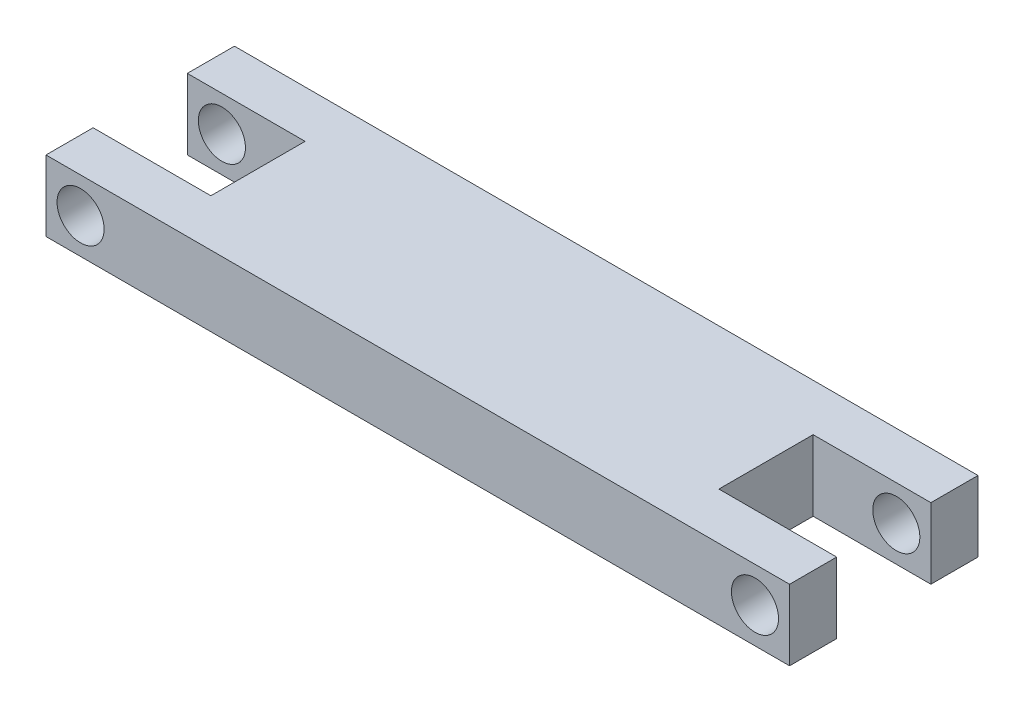
ISO-10303-21;
HEADER;
FILE_DESCRIPTION(('STEP AP214'),'2;1');
FILE_NAME('part.step','',(''),(''),'','','');
FILE_SCHEMA(('AUTOMOTIVE_DESIGN { 1 0 10303 214 1 1 1 1 }'));
ENDSEC;
DATA;
#1=APPLICATION_CONTEXT('core data for automotive mechanical design processes');
#2=APPLICATION_PROTOCOL_DEFINITION('international standard','automotive_design',2000,#1);
#3=PRODUCT_CONTEXT('',#1,'mechanical');
#4=PRODUCT('Part','Part','',(#3));
#5=PRODUCT_RELATED_PRODUCT_CATEGORY('part','',(#4));
#6=PRODUCT_DEFINITION_FORMATION('','',#4);
#7=PRODUCT_DEFINITION_CONTEXT('part definition',#1,'design');
#8=PRODUCT_DEFINITION('design','',#6,#7);
#9=PRODUCT_DEFINITION_SHAPE('','',#8);
#10=(LENGTH_UNIT() NAMED_UNIT(*) SI_UNIT(.MILLI.,.METRE.));
#11=(NAMED_UNIT(*) PLANE_ANGLE_UNIT() SI_UNIT($,.RADIAN.));
#12=(NAMED_UNIT(*) SI_UNIT($,.STERADIAN.) SOLID_ANGLE_UNIT());
#13=UNCERTAINTY_MEASURE_WITH_UNIT(LENGTH_MEASURE(1.E-05),#10,'distance_accuracy_value','');
#14=(GEOMETRIC_REPRESENTATION_CONTEXT(3) GLOBAL_UNCERTAINTY_ASSIGNED_CONTEXT((#13)) GLOBAL_UNIT_ASSIGNED_CONTEXT((#10,
#11,#12)) REPRESENTATION_CONTEXT('',''));
#15=CARTESIAN_POINT('',(0.,0.,0.));
#16=DIRECTION('',(0.,0.,1.));
#17=DIRECTION('',(1.,0.,0.));
#18=AXIS2_PLACEMENT_3D('',#15,#16,#17);
#19=CARTESIAN_POINT('',(-73.640350877193,15.5701754385965,40.));
#20=DIRECTION('',(1.,0.,0.));
#21=DIRECTION('',(0.,0.,-1.));
#22=AXIS2_PLACEMENT_3D('',#19,#20,#21);
#23=PLANE('',#22);
#24=DIRECTION('',(0.,0.,-1.));
#25=VECTOR('',#24,1.);
#26=CARTESIAN_POINT('',(-73.640350877193,15.5701754385965,40.));
#27=LINE('',#26,#25);
#28=CARTESIAN_POINT('',(-73.640350877193,15.5701754385965,40.));
#29=VERTEX_POINT('',#28);
#30=CARTESIAN_POINT('',(-73.640350877193,15.5701754385965,30.));
#31=VERTEX_POINT('',#30);
#32=EDGE_CURVE('E44',#29,#31,#27,.T.);
#33=ORIENTED_EDGE('',*,*,#32,.T.);
#34=DIRECTION('',(0.,-1.,0.));
#35=VECTOR('',#34,1.);
#36=CARTESIAN_POINT('',(-73.640350877193,15.5701754385965,30.));
#37=LINE('',#36,#35);
#38=CARTESIAN_POINT('',(-73.640350877193,0.570175438596493,30.));
#39=VERTEX_POINT('',#38);
#40=EDGE_CURVE('E118',#31,#39,#37,.T.);
#41=ORIENTED_EDGE('',*,*,#40,.T.);
#42=DIRECTION('',(0.,0.,-1.));
#43=VECTOR('',#42,1.);
#44=CARTESIAN_POINT('',(-73.640350877193,0.570175438596493,40.));
#45=LINE('',#44,#43);
#46=CARTESIAN_POINT('',(-73.640350877193,0.570175438596493,40.));
#47=VERTEX_POINT('',#46);
#48=EDGE_CURVE('E83',#47,#39,#45,.T.);
#49=ORIENTED_EDGE('',*,*,#48,.F.);
#50=DIRECTION('',(0.,-1.,0.));
#51=VECTOR('',#50,1.);
#52=CARTESIAN_POINT('',(-73.640350877193,15.5701754385965,40.));
#53=LINE('',#52,#51);
#54=EDGE_CURVE('E60',#29,#47,#53,.T.);
#55=ORIENTED_EDGE('',*,*,#54,.F.);
#56=EDGE_LOOP('',(#33,#41,#49,#55));
#57=FACE_BOUND('',#56,.T.);
#58=ADVANCED_FACE('F36',(#57),#23,.F.);
#59=CARTESIAN_POINT('',(-66.3006315789474,8.07017543859649,40.));
#60=DIRECTION('',(0.,0.,-1.));
#61=DIRECTION('',(-1.,0.,0.));
#62=AXIS2_PLACEMENT_3D('',#59,#60,#61);
#63=CYLINDRICAL_SURFACE('',#62,5.);
#64=CARTESIAN_POINT('',(-66.3006315789474,8.07017543859649,30.));
#65=DIRECTION('',(0.,0.,1.));
#66=DIRECTION('',(1.,0.,0.));
#67=AXIS2_PLACEMENT_3D('',#64,#65,#66);
#68=CIRCLE('',#67,5.);
#69=CARTESIAN_POINT('',(-61.3006315789474,8.07017543859649,30.));
#70=VERTEX_POINT('',#69);
#71=EDGE_CURVE('E112',#70,#70,#68,.T.);
#72=ORIENTED_EDGE('',*,*,#71,.F.);
#73=EDGE_LOOP('',(#72));
#74=FACE_BOUND('',#73,.T.);
#75=CARTESIAN_POINT('',(-66.3006315789474,8.07017543859649,40.));
#76=DIRECTION('',(0.,0.,1.));
#77=DIRECTION('',(1.,0.,0.));
#78=AXIS2_PLACEMENT_3D('',#75,#76,#77);
#79=CIRCLE('',#78,5.);
#80=CARTESIAN_POINT('',(-61.3006315789474,8.07017543859649,40.));
#81=VERTEX_POINT('',#80);
#82=EDGE_CURVE('E128',#81,#81,#79,.T.);
#83=ORIENTED_EDGE('',*,*,#82,.T.);
#84=EDGE_LOOP('',(#83));
#85=FACE_BOUND('',#84,.T.);
#86=ADVANCED_FACE('F282',(#74,#85),#63,.F.);
#87=CARTESIAN_POINT('',(0.,0.,40.));
#88=DIRECTION('',(0.,0.,1.));
#89=DIRECTION('',(1.,0.,0.));
#90=AXIS2_PLACEMENT_3D('',#87,#88,#89);
#91=PLANE('',#90);
#92=DIRECTION('',(1.,0.,0.));
#93=VECTOR('',#92,1.);
#94=CARTESIAN_POINT('',(-73.640350877193,0.570175438596493,40.));
#95=LINE('',#94,#93);
#96=CARTESIAN_POINT('',(84.1959975439387,0.570175438596493,40.));
#97=VERTEX_POINT('',#96);
#98=EDGE_CURVE('E84',#47,#97,#95,.T.);
#99=ORIENTED_EDGE('',*,*,#98,.T.);
#100=DIRECTION('',(0.,-1.,0.));
#101=VECTOR('',#100,1.);
#102=CARTESIAN_POINT('',(84.1959975439387,15.5701754385965,40.));
#103=LINE('',#102,#101);
#104=CARTESIAN_POINT('',(84.1959975439387,15.5701754385965,40.));
#105=VERTEX_POINT('',#104);
#106=EDGE_CURVE('E186',#105,#97,#103,.T.);
#107=ORIENTED_EDGE('',*,*,#106,.F.);
#108=DIRECTION('',(-1.,0.,0.));
#109=VECTOR('',#108,1.);
#110=CARTESIAN_POINT('',(-73.640350877193,15.5701754385965,40.));
#111=LINE('',#110,#109);
#112=EDGE_CURVE('E101',#105,#29,#111,.T.);
#113=ORIENTED_EDGE('',*,*,#112,.T.);
#114=ORIENTED_EDGE('',*,*,#54,.T.);
#115=EDGE_LOOP('',(#99,#107,#113,#114));
#116=FACE_BOUND('',#115,.T.);
#117=ORIENTED_EDGE('',*,*,#82,.F.);
#118=EDGE_LOOP('',(#117));
#119=FACE_BOUND('',#118,.T.);
#120=CARTESIAN_POINT('',(76.856278245693,8.07017543859649,40.));
#121=DIRECTION('',(0.,0.,-1.));
#122=DIRECTION('',(-1.,0.,0.));
#123=AXIS2_PLACEMENT_3D('',#120,#121,#122);
#124=CIRCLE('',#123,5.);
#125=CARTESIAN_POINT('',(71.8562782456931,8.07017543859649,40.));
#126=VERTEX_POINT('',#125);
#127=EDGE_CURVE('E243',#126,#126,#124,.T.);
#128=ORIENTED_EDGE('',*,*,#127,.T.);
#129=EDGE_LOOP('',(#128));
#130=FACE_BOUND('',#129,.T.);
#131=ADVANCED_FACE('F184',(#116,#119,#130),#91,.T.);
#132=CARTESIAN_POINT('',(0.,0.,0.));
#133=DIRECTION('',(0.,0.,1.));
#134=DIRECTION('',(1.,0.,0.));
#135=AXIS2_PLACEMENT_3D('',#132,#133,#134);
#136=PLANE('',#135);
#137=DIRECTION('',(-1.,0.,0.));
#138=VECTOR('',#137,1.);
#139=CARTESIAN_POINT('',(-73.640350877193,15.5701754385965,0.));
#140=LINE('',#139,#138);
#141=CARTESIAN_POINT('',(84.1959975439387,15.5701754385965,0.));
#142=VERTEX_POINT('',#141);
#143=CARTESIAN_POINT('',(-73.640350877193,15.5701754385965,0.));
#144=VERTEX_POINT('',#143);
#145=EDGE_CURVE('E94',#142,#144,#140,.T.);
#146=ORIENTED_EDGE('',*,*,#145,.F.);
#147=DIRECTION('',(0.,-1.,0.));
#148=VECTOR('',#147,1.);
#149=CARTESIAN_POINT('',(84.1959975439387,15.5701754385965,0.));
#150=LINE('',#149,#148);
#151=CARTESIAN_POINT('',(84.1959975439387,0.570175438596493,0.));
#152=VERTEX_POINT('',#151);
#153=EDGE_CURVE('E100',#142,#152,#150,.T.);
#154=ORIENTED_EDGE('',*,*,#153,.T.);
#155=DIRECTION('',(1.,0.,0.));
#156=VECTOR('',#155,1.);
#157=CARTESIAN_POINT('',(-73.640350877193,0.570175438596493,0.));
#158=LINE('',#157,#156);
#159=CARTESIAN_POINT('',(-73.640350877193,0.570175438596493,0.));
#160=VERTEX_POINT('',#159);
#161=EDGE_CURVE('E79',#160,#152,#158,.T.);
#162=ORIENTED_EDGE('',*,*,#161,.F.);
#163=DIRECTION('',(0.,-1.,0.));
#164=VECTOR('',#163,1.);
#165=CARTESIAN_POINT('',(-73.640350877193,15.5701754385965,0.));
#166=LINE('',#165,#164);
#167=EDGE_CURVE('E88',#144,#160,#166,.T.);
#168=ORIENTED_EDGE('',*,*,#167,.F.);
#169=EDGE_LOOP('',(#146,#154,#162,#168));
#170=FACE_BOUND('',#169,.T.);
#171=CARTESIAN_POINT('',(-66.3006315789474,8.07017543859649,0.));
#172=DIRECTION('',(0.,0.,1.));
#173=DIRECTION('',(1.,0.,0.));
#174=AXIS2_PLACEMENT_3D('',#171,#172,#173);
#175=CIRCLE('',#174,5.);
#176=CARTESIAN_POINT('',(-61.3006315789474,8.07017543859649,0.));
#177=VERTEX_POINT('',#176);
#178=EDGE_CURVE('E127',#177,#177,#175,.T.);
#179=ORIENTED_EDGE('',*,*,#178,.T.);
#180=EDGE_LOOP('',(#179));
#181=FACE_BOUND('',#180,.T.);
#182=CARTESIAN_POINT('',(76.856278245693,8.07017543859649,0.));
#183=DIRECTION('',(0.,0.,-1.));
#184=DIRECTION('',(-1.,0.,0.));
#185=AXIS2_PLACEMENT_3D('',#182,#183,#184);
#186=CIRCLE('',#185,5.);
#187=CARTESIAN_POINT('',(71.8562782456931,8.07017543859649,0.));
#188=VERTEX_POINT('',#187);
#189=EDGE_CURVE('E242',#188,#188,#186,.T.);
#190=ORIENTED_EDGE('',*,*,#189,.F.);
#191=EDGE_LOOP('',(#190));
#192=FACE_BOUND('',#191,.T.);
#193=ADVANCED_FACE('F97',(#170,#181,#192),#136,.F.);
#194=CARTESIAN_POINT('',(-73.640350877193,15.5701754385965,40.));
#195=DIRECTION('',(0.,-1.,0.));
#196=DIRECTION('',(0.,0.,-1.));
#197=AXIS2_PLACEMENT_3D('',#194,#195,#196);
#198=PLANE('',#197);
#199=ORIENTED_EDGE('',*,*,#112,.F.);
#200=DIRECTION('',(0.,0.,-1.));
#201=VECTOR('',#200,1.);
#202=CARTESIAN_POINT('',(84.1959975439387,15.5701754385965,40.));
#203=LINE('',#202,#201);
#204=CARTESIAN_POINT('',(84.1959975439387,15.5701754385965,30.));
#205=VERTEX_POINT('',#204);
#206=EDGE_CURVE('E252',#105,#205,#203,.T.);
#207=ORIENTED_EDGE('',*,*,#206,.T.);
#208=DIRECTION('',(-1.,0.,0.));
#209=VECTOR('',#208,1.);
#210=CARTESIAN_POINT('',(109.195997543939,15.5701754385965,30.));
#211=LINE('',#210,#209);
#212=CARTESIAN_POINT('',(59.1959975439387,15.5701754385965,30.));
#213=VERTEX_POINT('',#212);
#214=EDGE_CURVE('E220',#205,#213,#211,.T.);
#215=ORIENTED_EDGE('',*,*,#214,.T.);
#216=DIRECTION('',(0.,0.,-1.));
#217=VECTOR('',#216,1.);
#218=CARTESIAN_POINT('',(59.1959975439387,15.5701754385965,10.));
#219=LINE('',#218,#217);
#220=CARTESIAN_POINT('',(59.1959975439387,15.5701754385965,10.));
#221=VERTEX_POINT('',#220);
#222=EDGE_CURVE('E213',#213,#221,#219,.T.);
#223=ORIENTED_EDGE('',*,*,#222,.T.);
#224=DIRECTION('',(1.,0.,0.));
#225=VECTOR('',#224,1.);
#226=CARTESIAN_POINT('',(109.195997543939,15.5701754385965,10.));
#227=LINE('',#226,#225);
#228=CARTESIAN_POINT('',(84.1959975439387,15.5701754385965,10.));
#229=VERTEX_POINT('',#228);
#230=EDGE_CURVE('E222',#221,#229,#227,.T.);
#231=ORIENTED_EDGE('',*,*,#230,.T.);
#232=EDGE_CURVE('E141',#229,#142,#203,.T.);
#233=ORIENTED_EDGE('',*,*,#232,.T.);
#234=ORIENTED_EDGE('',*,*,#145,.T.);
#235=CARTESIAN_POINT('',(-73.640350877193,15.5701754385965,10.));
#236=VERTEX_POINT('',#235);
#237=EDGE_CURVE('E91',#236,#144,#27,.T.);
#238=ORIENTED_EDGE('',*,*,#237,.F.);
#239=DIRECTION('',(-1.,0.,0.));
#240=VECTOR('',#239,1.);
#241=CARTESIAN_POINT('',(-98.640350877193,15.5701754385965,10.));
#242=LINE('',#241,#240);
#243=CARTESIAN_POINT('',(-48.640350877193,15.5701754385965,10.));
#244=VERTEX_POINT('',#243);
#245=EDGE_CURVE('E262',#244,#236,#242,.T.);
#246=ORIENTED_EDGE('',*,*,#245,.F.);
#247=DIRECTION('',(0.,0.,-1.));
#248=VECTOR('',#247,1.);
#249=CARTESIAN_POINT('',(-48.640350877193,15.5701754385965,10.));
#250=LINE('',#249,#248);
#251=CARTESIAN_POINT('',(-48.640350877193,15.5701754385965,30.));
#252=VERTEX_POINT('',#251);
#253=EDGE_CURVE('E259',#252,#244,#250,.T.);
#254=ORIENTED_EDGE('',*,*,#253,.F.);
#255=DIRECTION('',(1.,0.,0.));
#256=VECTOR('',#255,1.);
#257=CARTESIAN_POINT('',(-98.640350877193,15.5701754385965,30.));
#258=LINE('',#257,#256);
#259=EDGE_CURVE('E264',#31,#252,#258,.T.);
#260=ORIENTED_EDGE('',*,*,#259,.F.);
#261=ORIENTED_EDGE('',*,*,#32,.F.);
#262=EDGE_LOOP('',(#199,#207,#215,#223,#231,#233,#234,#238,#246,#254,#260,#261));
#263=FACE_BOUND('',#262,.T.);
#264=ADVANCED_FACE('F38',(#263),#198,.F.);
#265=CARTESIAN_POINT('',(-73.640350877193,0.570175438596493,10.));
#266=VERTEX_POINT('',#265);
#267=EDGE_CURVE('E73',#266,#160,#45,.T.);
#268=ORIENTED_EDGE('',*,*,#267,.F.);
#269=DIRECTION('',(0.,1.,0.));
#270=VECTOR('',#269,1.);
#271=CARTESIAN_POINT('',(-73.640350877193,15.5701754385965,10.));
#272=LINE('',#271,#270);
#273=EDGE_CURVE('E51',#266,#236,#272,.T.);
#274=ORIENTED_EDGE('',*,*,#273,.T.);
#275=ORIENTED_EDGE('',*,*,#237,.T.);
#276=ORIENTED_EDGE('',*,*,#167,.T.);
#277=EDGE_LOOP('',(#268,#274,#275,#276));
#278=FACE_BOUND('',#277,.T.);
#279=ADVANCED_FACE('F89',(#278),#23,.F.);
#280=CARTESIAN_POINT('',(-73.640350877193,0.570175438596493,40.));
#281=DIRECTION('',(0.,1.,0.));
#282=DIRECTION('',(0.,0.,1.));
#283=AXIS2_PLACEMENT_3D('',#280,#281,#282);
#284=PLANE('',#283);
#285=ORIENTED_EDGE('',*,*,#161,.T.);
#286=DIRECTION('',(0.,0.,-1.));
#287=VECTOR('',#286,1.);
#288=CARTESIAN_POINT('',(84.1959975439387,0.570175438596493,40.));
#289=LINE('',#288,#287);
#290=CARTESIAN_POINT('',(84.1959975439387,0.570175438596493,10.));
#291=VERTEX_POINT('',#290);
#292=EDGE_CURVE('E249',#291,#152,#289,.T.);
#293=ORIENTED_EDGE('',*,*,#292,.F.);
#294=DIRECTION('',(1.,0.,0.));
#295=VECTOR('',#294,1.);
#296=CARTESIAN_POINT('',(84.1959975439387,0.570175438596493,10.));
#297=LINE('',#296,#295);
#298=CARTESIAN_POINT('',(59.1959975439387,0.570175438596492,10.));
#299=VERTEX_POINT('',#298);
#300=EDGE_CURVE('E232',#299,#291,#297,.T.);
#301=ORIENTED_EDGE('',*,*,#300,.F.);
#302=DIRECTION('',(0.,0.,-1.));
#303=VECTOR('',#302,1.);
#304=CARTESIAN_POINT('',(59.1959975439387,0.570175438596493,40.));
#305=LINE('',#304,#303);
#306=CARTESIAN_POINT('',(59.1959975439387,0.570175438596492,30.));
#307=VERTEX_POINT('',#306);
#308=EDGE_CURVE('E216',#307,#299,#305,.T.);
#309=ORIENTED_EDGE('',*,*,#308,.F.);
#310=DIRECTION('',(-1.,0.,0.));
#311=VECTOR('',#310,1.);
#312=CARTESIAN_POINT('',(84.1959975439387,0.570175438596493,30.));
#313=LINE('',#312,#311);
#314=CARTESIAN_POINT('',(84.1959975439387,0.570175438596493,30.));
#315=VERTEX_POINT('',#314);
#316=EDGE_CURVE('E236',#315,#307,#313,.T.);
#317=ORIENTED_EDGE('',*,*,#316,.F.);
#318=EDGE_CURVE('E181',#97,#315,#289,.T.);
#319=ORIENTED_EDGE('',*,*,#318,.F.);
#320=ORIENTED_EDGE('',*,*,#98,.F.);
#321=ORIENTED_EDGE('',*,*,#48,.T.);
#322=DIRECTION('',(1.,0.,0.));
#323=VECTOR('',#322,1.);
#324=CARTESIAN_POINT('',(-73.640350877193,0.570175438596493,30.));
#325=LINE('',#324,#323);
#326=CARTESIAN_POINT('',(-48.640350877193,0.570175438596492,30.));
#327=VERTEX_POINT('',#326);
#328=EDGE_CURVE('E114',#39,#327,#325,.T.);
#329=ORIENTED_EDGE('',*,*,#328,.T.);
#330=DIRECTION('',(0.,0.,-1.));
#331=VECTOR('',#330,1.);
#332=CARTESIAN_POINT('',(-48.640350877193,0.570175438596493,40.));
#333=LINE('',#332,#331);
#334=CARTESIAN_POINT('',(-48.640350877193,0.570175438596492,10.));
#335=VERTEX_POINT('',#334);
#336=EDGE_CURVE('E11',#327,#335,#333,.T.);
#337=ORIENTED_EDGE('',*,*,#336,.T.);
#338=DIRECTION('',(-1.,0.,0.));
#339=VECTOR('',#338,1.);
#340=CARTESIAN_POINT('',(-73.640350877193,0.570175438596493,10.));
#341=LINE('',#340,#339);
#342=EDGE_CURVE('E81',#335,#266,#341,.T.);
#343=ORIENTED_EDGE('',*,*,#342,.T.);
#344=ORIENTED_EDGE('',*,*,#267,.T.);
#345=EDGE_LOOP('',(#285,#293,#301,#309,#317,#319,#320,#321,#329,#337,#343,#344));
#346=FACE_BOUND('',#345,.T.);
#347=ADVANCED_FACE('F75',(#346),#284,.F.);
#348=CARTESIAN_POINT('',(-66.3006315789474,8.07017543859649,10.));
#349=DIRECTION('',(0.,0.,-1.));
#350=DIRECTION('',(-1.,0.,0.));
#351=AXIS2_PLACEMENT_3D('',#348,#349,#350);
#352=CIRCLE('',#351,5.);
#353=CARTESIAN_POINT('',(-71.3006315789473,8.07017543859649,10.));
#354=VERTEX_POINT('',#353);
#355=EDGE_CURVE('E109',#354,#354,#352,.T.);
#356=ORIENTED_EDGE('',*,*,#355,.F.);
#357=EDGE_LOOP('',(#356));
#358=FACE_BOUND('',#357,.T.);
#359=ORIENTED_EDGE('',*,*,#178,.F.);
#360=EDGE_LOOP('',(#359));
#361=FACE_BOUND('',#360,.T.);
#362=ADVANCED_FACE('F273',(#358,#361),#63,.F.);
#363=CARTESIAN_POINT('',(-48.640350877193,-24.4298245614035,10.));
#364=DIRECTION('',(1.,0.,0.));
#365=DIRECTION('',(0.,0.,-1.));
#366=AXIS2_PLACEMENT_3D('',#363,#364,#365);
#367=PLANE('',#366);
#368=DIRECTION('',(0.,1.,0.));
#369=VECTOR('',#368,1.);
#370=CARTESIAN_POINT('',(-48.640350877193,-24.4298245614035,30.));
#371=LINE('',#370,#369);
#372=EDGE_CURVE('E111',#327,#252,#371,.T.);
#373=ORIENTED_EDGE('',*,*,#372,.T.);
#374=ORIENTED_EDGE('',*,*,#253,.T.);
#375=DIRECTION('',(0.,1.,0.));
#376=VECTOR('',#375,1.);
#377=CARTESIAN_POINT('',(-48.640350877193,-24.4298245614035,10.));
#378=LINE('',#377,#376);
#379=EDGE_CURVE('E266',#335,#244,#378,.T.);
#380=ORIENTED_EDGE('',*,*,#379,.F.);
#381=ORIENTED_EDGE('',*,*,#336,.F.);
#382=EDGE_LOOP('',(#373,#374,#380,#381));
#383=FACE_BOUND('',#382,.T.);
#384=ADVANCED_FACE('F271',(#383),#367,.F.);
#385=CARTESIAN_POINT('',(-98.640350877193,-24.4298245614035,30.));
#386=DIRECTION('',(0.,0.,1.));
#387=DIRECTION('',(1.,0.,0.));
#388=AXIS2_PLACEMENT_3D('',#385,#386,#387);
#389=PLANE('',#388);
#390=ORIENTED_EDGE('',*,*,#71,.T.);
#391=EDGE_LOOP('',(#390));
#392=FACE_BOUND('',#391,.T.);
#393=ORIENTED_EDGE('',*,*,#259,.T.);
#394=ORIENTED_EDGE('',*,*,#372,.F.);
#395=ORIENTED_EDGE('',*,*,#328,.F.);
#396=ORIENTED_EDGE('',*,*,#40,.F.);
#397=EDGE_LOOP('',(#393,#394,#395,#396));
#398=FACE_BOUND('',#397,.T.);
#399=ADVANCED_FACE('F174',(#392,#398),#389,.F.);
#400=CARTESIAN_POINT('',(-98.640350877193,-24.4298245614035,10.));
#401=DIRECTION('',(0.,0.,-1.));
#402=DIRECTION('',(-1.,0.,0.));
#403=AXIS2_PLACEMENT_3D('',#400,#401,#402);
#404=PLANE('',#403);
#405=ORIENTED_EDGE('',*,*,#355,.T.);
#406=EDGE_LOOP('',(#405));
#407=FACE_BOUND('',#406,.T.);
#408=ORIENTED_EDGE('',*,*,#342,.F.);
#409=ORIENTED_EDGE('',*,*,#379,.T.);
#410=ORIENTED_EDGE('',*,*,#245,.T.);
#411=ORIENTED_EDGE('',*,*,#273,.F.);
#412=EDGE_LOOP('',(#408,#409,#410,#411));
#413=FACE_BOUND('',#412,.T.);
#414=ADVANCED_FACE('F268',(#407,#413),#404,.F.);
#415=CARTESIAN_POINT('',(84.1959975439387,15.5701754385965,40.));
#416=DIRECTION('',(-1.,0.,0.));
#417=DIRECTION('',(0.,0.,-1.));
#418=AXIS2_PLACEMENT_3D('',#415,#416,#417);
#419=PLANE('',#418);
#420=ORIENTED_EDGE('',*,*,#206,.F.);
#421=ORIENTED_EDGE('',*,*,#106,.T.);
#422=ORIENTED_EDGE('',*,*,#318,.T.);
#423=DIRECTION('',(0.,-1.,0.));
#424=VECTOR('',#423,1.);
#425=CARTESIAN_POINT('',(84.1959975439387,15.5701754385965,30.));
#426=LINE('',#425,#424);
#427=EDGE_CURVE('E239',#205,#315,#426,.T.);
#428=ORIENTED_EDGE('',*,*,#427,.F.);
#429=EDGE_LOOP('',(#420,#421,#422,#428));
#430=FACE_BOUND('',#429,.T.);
#431=ADVANCED_FACE('F375',(#430),#419,.F.);
#432=CARTESIAN_POINT('',(76.856278245693,8.07017543859649,40.));
#433=DIRECTION('',(0.,0.,-1.));
#434=DIRECTION('',(1.,0.,0.));
#435=AXIS2_PLACEMENT_3D('',#432,#433,#434);
#436=CYLINDRICAL_SURFACE('',#435,5.);
#437=CARTESIAN_POINT('',(76.856278245693,8.07017543859649,30.));
#438=DIRECTION('',(0.,0.,-1.));
#439=DIRECTION('',(-1.,0.,0.));
#440=AXIS2_PLACEMENT_3D('',#437,#438,#439);
#441=CIRCLE('',#440,5.);
#442=CARTESIAN_POINT('',(71.8562782456931,8.07017543859649,30.));
#443=VERTEX_POINT('',#442);
#444=EDGE_CURVE('E235',#443,#443,#441,.T.);
#445=ORIENTED_EDGE('',*,*,#444,.T.);
#446=EDGE_LOOP('',(#445));
#447=FACE_BOUND('',#446,.T.);
#448=ORIENTED_EDGE('',*,*,#127,.F.);
#449=EDGE_LOOP('',(#448));
#450=FACE_BOUND('',#449,.T.);
#451=ADVANCED_FACE('F380',(#447,#450),#436,.F.);
#452=ORIENTED_EDGE('',*,*,#292,.T.);
#453=ORIENTED_EDGE('',*,*,#153,.F.);
#454=ORIENTED_EDGE('',*,*,#232,.F.);
#455=DIRECTION('',(0.,1.,0.));
#456=VECTOR('',#455,1.);
#457=CARTESIAN_POINT('',(84.1959975439387,15.5701754385965,10.));
#458=LINE('',#457,#456);
#459=EDGE_CURVE('E225',#291,#229,#458,.T.);
#460=ORIENTED_EDGE('',*,*,#459,.F.);
#461=EDGE_LOOP('',(#452,#453,#454,#460));
#462=FACE_BOUND('',#461,.T.);
#463=ADVANCED_FACE('F383',(#462),#419,.F.);
#464=CARTESIAN_POINT('',(76.856278245693,8.07017543859649,10.));
#465=DIRECTION('',(0.,0.,1.));
#466=DIRECTION('',(1.,0.,0.));
#467=AXIS2_PLACEMENT_3D('',#464,#465,#466);
#468=CIRCLE('',#467,5.);
#469=CARTESIAN_POINT('',(81.856278245693,8.07017543859649,10.));
#470=VERTEX_POINT('',#469);
#471=EDGE_CURVE('E230',#470,#470,#468,.T.);
#472=ORIENTED_EDGE('',*,*,#471,.T.);
#473=EDGE_LOOP('',(#472));
#474=FACE_BOUND('',#473,.T.);
#475=ORIENTED_EDGE('',*,*,#189,.T.);
#476=EDGE_LOOP('',(#475));
#477=FACE_BOUND('',#476,.T.);
#478=ADVANCED_FACE('F394',(#474,#477),#436,.F.);
#479=CARTESIAN_POINT('',(59.1959975439387,-24.4298245614035,10.));
#480=DIRECTION('',(-1.,0.,0.));
#481=DIRECTION('',(0.,0.,-1.));
#482=AXIS2_PLACEMENT_3D('',#479,#480,#481);
#483=PLANE('',#482);
#484=DIRECTION('',(0.,1.,0.));
#485=VECTOR('',#484,1.);
#486=CARTESIAN_POINT('',(59.1959975439387,-24.4298245614035,30.));
#487=LINE('',#486,#485);
#488=EDGE_CURVE('E219',#307,#213,#487,.T.);
#489=ORIENTED_EDGE('',*,*,#488,.F.);
#490=ORIENTED_EDGE('',*,*,#308,.T.);
#491=DIRECTION('',(0.,1.,0.));
#492=VECTOR('',#491,1.);
#493=CARTESIAN_POINT('',(59.1959975439387,-24.4298245614035,10.));
#494=LINE('',#493,#492);
#495=EDGE_CURVE('E209',#299,#221,#494,.T.);
#496=ORIENTED_EDGE('',*,*,#495,.T.);
#497=ORIENTED_EDGE('',*,*,#222,.F.);
#498=EDGE_LOOP('',(#489,#490,#496,#497));
#499=FACE_BOUND('',#498,.T.);
#500=ADVANCED_FACE('F211',(#499),#483,.F.);
#501=CARTESIAN_POINT('',(109.195997543939,-24.4298245614035,30.));
#502=DIRECTION('',(0.,0.,1.));
#503=DIRECTION('',(-1.,0.,0.));
#504=AXIS2_PLACEMENT_3D('',#501,#502,#503);
#505=PLANE('',#504);
#506=ORIENTED_EDGE('',*,*,#444,.F.);
#507=EDGE_LOOP('',(#506));
#508=FACE_BOUND('',#507,.T.);
#509=ORIENTED_EDGE('',*,*,#214,.F.);
#510=ORIENTED_EDGE('',*,*,#427,.T.);
#511=ORIENTED_EDGE('',*,*,#316,.T.);
#512=ORIENTED_EDGE('',*,*,#488,.T.);
#513=EDGE_LOOP('',(#509,#510,#511,#512));
#514=FACE_BOUND('',#513,.T.);
#515=ADVANCED_FACE('F421',(#508,#514),#505,.F.);
#516=CARTESIAN_POINT('',(109.195997543939,-24.4298245614035,10.));
#517=DIRECTION('',(0.,0.,-1.));
#518=DIRECTION('',(1.,0.,0.));
#519=AXIS2_PLACEMENT_3D('',#516,#517,#518);
#520=PLANE('',#519);
#521=ORIENTED_EDGE('',*,*,#471,.F.);
#522=EDGE_LOOP('',(#521));
#523=FACE_BOUND('',#522,.T.);
#524=ORIENTED_EDGE('',*,*,#300,.T.);
#525=ORIENTED_EDGE('',*,*,#459,.T.);
#526=ORIENTED_EDGE('',*,*,#230,.F.);
#527=ORIENTED_EDGE('',*,*,#495,.F.);
#528=EDGE_LOOP('',(#524,#525,#526,#527));
#529=FACE_BOUND('',#528,.T.);
#530=ADVANCED_FACE('F223',(#523,#529),#520,.F.);
#531=CLOSED_SHELL('',(#58,#86,#131,#193,#264,#279,#347,#362,#384,#399,#414,#431,#451,#463,#478,
#500,#515,#530));
#532=MANIFOLD_SOLID_BREP('B2',#531);
#533=ADVANCED_BREP_SHAPE_REPRESENTATION('',(#18,#532),#14);
#534=SHAPE_DEFINITION_REPRESENTATION(#9,#533);
ENDSEC;
END-ISO-10303-21;
